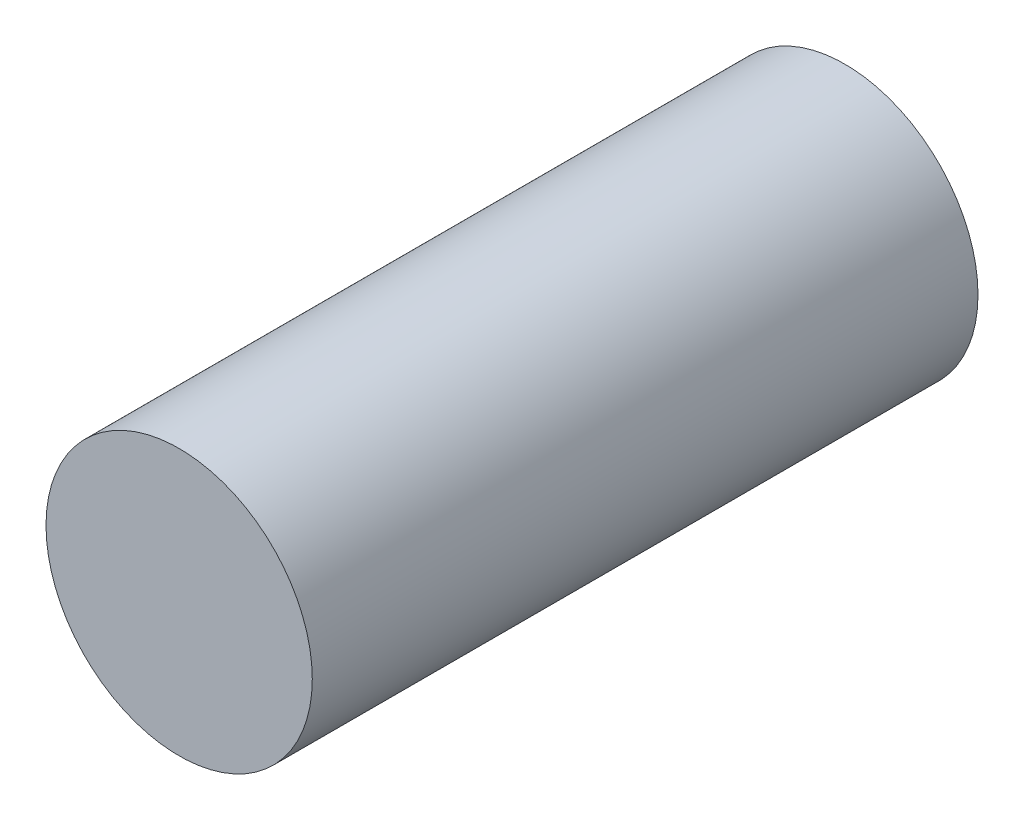
ISO-10303-21;
HEADER;
FILE_DESCRIPTION(('STEP AP214'),'2;1');
FILE_NAME('part.step','',(''),(''),'','','');
FILE_SCHEMA(('AUTOMOTIVE_DESIGN { 1 0 10303 214 1 1 1 1 }'));
ENDSEC;
DATA;
#1=APPLICATION_CONTEXT('core data for automotive mechanical design processes');
#2=APPLICATION_PROTOCOL_DEFINITION('international standard','automotive_design',2000,#1);
#3=PRODUCT_CONTEXT('',#1,'mechanical');
#4=PRODUCT('Part','Part','',(#3));
#5=PRODUCT_RELATED_PRODUCT_CATEGORY('part','',(#4));
#6=PRODUCT_DEFINITION_FORMATION('','',#4);
#7=PRODUCT_DEFINITION_CONTEXT('part definition',#1,'design');
#8=PRODUCT_DEFINITION('design','',#6,#7);
#9=PRODUCT_DEFINITION_SHAPE('','',#8);
#10=(LENGTH_UNIT() NAMED_UNIT(*) SI_UNIT(.MILLI.,.METRE.));
#11=(NAMED_UNIT(*) PLANE_ANGLE_UNIT() SI_UNIT($,.RADIAN.));
#12=(NAMED_UNIT(*) SI_UNIT($,.STERADIAN.) SOLID_ANGLE_UNIT());
#13=UNCERTAINTY_MEASURE_WITH_UNIT(LENGTH_MEASURE(1.E-05),#10,'distance_accuracy_value','');
#14=(GEOMETRIC_REPRESENTATION_CONTEXT(3) GLOBAL_UNCERTAINTY_ASSIGNED_CONTEXT((#13)) GLOBAL_UNIT_ASSIGNED_CONTEXT((#10,
#11,#12)) REPRESENTATION_CONTEXT('',''));
#15=CARTESIAN_POINT('',(0.,0.,0.));
#16=DIRECTION('',(0.,0.,1.));
#17=DIRECTION('',(1.,0.,0.));
#18=AXIS2_PLACEMENT_3D('',#15,#16,#17);
#19=CARTESIAN_POINT('',(0.,0.,25.4));
#20=DIRECTION('',(0.,0.,-1.));
#21=DIRECTION('',(-1.,0.,0.));
#22=AXIS2_PLACEMENT_3D('',#19,#20,#21);
#23=CYLINDRICAL_SURFACE('',#22,5.08);
#24=CARTESIAN_POINT('',(0.,0.,25.4));
#25=DIRECTION('',(0.,0.,1.));
#26=DIRECTION('',(1.,0.,0.));
#27=AXIS2_PLACEMENT_3D('',#24,#25,#26);
#28=CIRCLE('',#27,5.08);
#29=CARTESIAN_POINT('',(5.08,0.,25.4));
#30=VERTEX_POINT('',#29);
#31=EDGE_CURVE('E10',#30,#30,#28,.T.);
#32=ORIENTED_EDGE('',*,*,#31,.F.);
#33=EDGE_LOOP('',(#32));
#34=FACE_BOUND('',#33,.T.);
#35=CARTESIAN_POINT('',(0.,0.,0.));
#36=DIRECTION('',(0.,0.,1.));
#37=DIRECTION('',(1.,0.,0.));
#38=AXIS2_PLACEMENT_3D('',#35,#36,#37);
#39=CIRCLE('',#38,5.08);
#40=CARTESIAN_POINT('',(5.08,0.,0.));
#41=VERTEX_POINT('',#40);
#42=EDGE_CURVE('E36',#41,#41,#39,.T.);
#43=ORIENTED_EDGE('',*,*,#42,.T.);
#44=EDGE_LOOP('',(#43));
#45=FACE_BOUND('',#44,.T.);
#46=ADVANCED_FACE('F33',(#34,#45),#23,.T.);
#47=CARTESIAN_POINT('',(0.,0.,25.4));
#48=DIRECTION('',(0.,0.,1.));
#49=DIRECTION('',(1.,0.,0.));
#50=AXIS2_PLACEMENT_3D('',#47,#48,#49);
#51=PLANE('',#50);
#52=ORIENTED_EDGE('',*,*,#31,.T.);
#53=EDGE_LOOP('',(#52));
#54=FACE_BOUND('',#53,.T.);
#55=ADVANCED_FACE('F48',(#54),#51,.T.);
#56=CARTESIAN_POINT('',(0.,0.,0.));
#57=DIRECTION('',(0.,0.,1.));
#58=DIRECTION('',(1.,0.,0.));
#59=AXIS2_PLACEMENT_3D('',#56,#57,#58);
#60=PLANE('',#59);
#61=ORIENTED_EDGE('',*,*,#42,.F.);
#62=EDGE_LOOP('',(#61));
#63=FACE_BOUND('',#62,.T.);
#64=ADVANCED_FACE('F46',(#63),#60,.F.);
#65=CLOSED_SHELL('',(#46,#55,#64));
#66=MANIFOLD_SOLID_BREP('B2',#65);
#67=ADVANCED_BREP_SHAPE_REPRESENTATION('',(#18,#66),#14);
#68=SHAPE_DEFINITION_REPRESENTATION(#9,#67);
ENDSEC;
END-ISO-10303-21;
